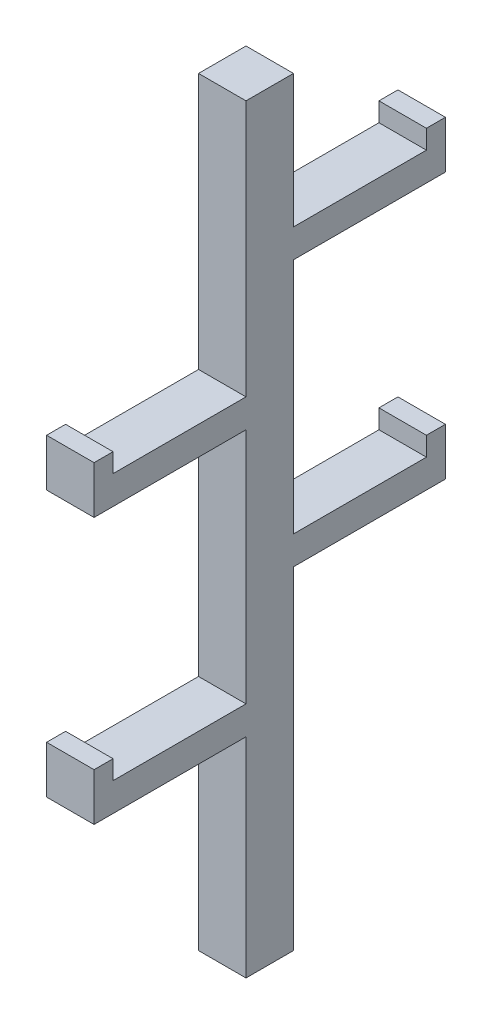
ISO-10303-21;
HEADER;
FILE_DESCRIPTION(('STEP AP214'),'2;1');
FILE_NAME('part.step','',(''),(''),'','','');
FILE_SCHEMA(('AUTOMOTIVE_DESIGN { 1 0 10303 214 1 1 1 1 }'));
ENDSEC;
DATA;
#1=APPLICATION_CONTEXT('core data for automotive mechanical design processes');
#2=APPLICATION_PROTOCOL_DEFINITION('international standard','automotive_design',2000,#1);
#3=PRODUCT_CONTEXT('',#1,'mechanical');
#4=PRODUCT('Part','Part','',(#3));
#5=PRODUCT_RELATED_PRODUCT_CATEGORY('part','',(#4));
#6=PRODUCT_DEFINITION_FORMATION('','',#4);
#7=PRODUCT_DEFINITION_CONTEXT('part definition',#1,'design');
#8=PRODUCT_DEFINITION('design','',#6,#7);
#9=PRODUCT_DEFINITION_SHAPE('','',#8);
#10=(LENGTH_UNIT() NAMED_UNIT(*) SI_UNIT(.MILLI.,.METRE.));
#11=(NAMED_UNIT(*) PLANE_ANGLE_UNIT() SI_UNIT($,.RADIAN.));
#12=(NAMED_UNIT(*) SI_UNIT($,.STERADIAN.) SOLID_ANGLE_UNIT());
#13=UNCERTAINTY_MEASURE_WITH_UNIT(LENGTH_MEASURE(1.E-05),#10,'distance_accuracy_value','');
#14=(GEOMETRIC_REPRESENTATION_CONTEXT(3) GLOBAL_UNCERTAINTY_ASSIGNED_CONTEXT((#13)) GLOBAL_UNIT_ASSIGNED_CONTEXT((#10,
#11,#12)) REPRESENTATION_CONTEXT('',''));
#15=CARTESIAN_POINT('',(0.,0.,0.));
#16=DIRECTION('',(0.,0.,1.));
#17=DIRECTION('',(1.,0.,0.));
#18=AXIS2_PLACEMENT_3D('',#15,#16,#17);
#19=CARTESIAN_POINT('',(-3.175,67.31,23.495));
#20=DIRECTION('',(0.,-1.,0.));
#21=DIRECTION('',(0.,0.,-1.));
#22=AXIS2_PLACEMENT_3D('',#19,#20,#21);
#23=PLANE('',#22);
#24=DIRECTION('',(-1.,0.,0.));
#25=VECTOR('',#24,1.);
#26=CARTESIAN_POINT('',(3.175,67.31,20.955));
#27=LINE('',#26,#25);
#28=CARTESIAN_POINT('',(3.175,67.31,20.955));
#29=VERTEX_POINT('',#28);
#30=CARTESIAN_POINT('',(-3.175,67.31,20.955));
#31=VERTEX_POINT('',#30);
#32=EDGE_CURVE('E244',#29,#31,#27,.T.);
#33=ORIENTED_EDGE('',*,*,#32,.F.);
#34=DIRECTION('',(0.,0.,-1.));
#35=VECTOR('',#34,1.);
#36=CARTESIAN_POINT('',(3.175,67.31,23.495));
#37=LINE('',#36,#35);
#38=CARTESIAN_POINT('',(3.175,67.31,3.175));
#39=VERTEX_POINT('',#38);
#40=EDGE_CURVE('E250',#29,#39,#37,.T.);
#41=ORIENTED_EDGE('',*,*,#40,.T.);
#42=DIRECTION('',(-1.,0.,0.));
#43=VECTOR('',#42,1.);
#44=CARTESIAN_POINT('',(-3.175,67.31,3.175));
#45=LINE('',#44,#43);
#46=CARTESIAN_POINT('',(-3.175,67.31,3.175));
#47=VERTEX_POINT('',#46);
#48=EDGE_CURVE('E360',#39,#47,#45,.T.);
#49=ORIENTED_EDGE('',*,*,#48,.T.);
#50=DIRECTION('',(0.,0.,-1.));
#51=VECTOR('',#50,1.);
#52=CARTESIAN_POINT('',(-3.175,67.31,23.495));
#53=LINE('',#52,#51);
#54=EDGE_CURVE('E357',#31,#47,#53,.T.);
#55=ORIENTED_EDGE('',*,*,#54,.F.);
#56=EDGE_LOOP('',(#33,#41,#49,#55));
#57=FACE_BOUND('',#56,.T.);
#58=ADVANCED_FACE('F40',(#57),#23,.F.);
#59=CARTESIAN_POINT('',(0.,83.82,-23.495));
#60=DIRECTION('',(0.,1.,0.));
#61=DIRECTION('',(0.,0.,1.));
#62=AXIS2_PLACEMENT_3D('',#59,#60,#61);
#63=PLANE('',#62);
#64=DIRECTION('',(0.,0.,1.));
#65=VECTOR('',#64,1.);
#66=CARTESIAN_POINT('',(3.175,83.82,-23.495));
#67=LINE('',#66,#65);
#68=CARTESIAN_POINT('',(3.175,83.82,-20.955));
#69=VERTEX_POINT('',#68);
#70=CARTESIAN_POINT('',(3.175,83.82,-3.175));
#71=VERTEX_POINT('',#70);
#72=EDGE_CURVE('E61',#69,#71,#67,.T.);
#73=ORIENTED_EDGE('',*,*,#72,.F.);
#74=DIRECTION('',(1.,0.,0.));
#75=VECTOR('',#74,1.);
#76=CARTESIAN_POINT('',(-3.175,83.82,-20.955));
#77=LINE('',#76,#75);
#78=CARTESIAN_POINT('',(-3.175,83.82,-20.955));
#79=VERTEX_POINT('',#78);
#80=EDGE_CURVE('E56',#79,#69,#77,.T.);
#81=ORIENTED_EDGE('',*,*,#80,.F.);
#82=DIRECTION('',(0.,0.,1.));
#83=VECTOR('',#82,1.);
#84=CARTESIAN_POINT('',(-3.175,83.82,-23.495));
#85=LINE('',#84,#83);
#86=CARTESIAN_POINT('',(-3.175,83.82,-3.175));
#87=VERTEX_POINT('',#86);
#88=EDGE_CURVE('E322',#79,#87,#85,.T.);
#89=ORIENTED_EDGE('',*,*,#88,.T.);
#90=DIRECTION('',(-1.,0.,0.));
#91=VECTOR('',#90,1.);
#92=CARTESIAN_POINT('',(0.,83.82,-3.175));
#93=LINE('',#92,#91);
#94=EDGE_CURVE('E310',#71,#87,#93,.T.);
#95=ORIENTED_EDGE('',*,*,#94,.F.);
#96=EDGE_LOOP('',(#73,#81,#89,#95));
#97=FACE_BOUND('',#96,.T.);
#98=ADVANCED_FACE('F486',(#97),#63,.T.);
#99=CARTESIAN_POINT('',(3.175,48.26,-23.495));
#100=DIRECTION('',(0.,1.,0.));
#101=DIRECTION('',(0.,0.,1.));
#102=AXIS2_PLACEMENT_3D('',#99,#100,#101);
#103=PLANE('',#102);
#104=DIRECTION('',(0.,0.,1.));
#105=VECTOR('',#104,1.);
#106=CARTESIAN_POINT('',(3.175,48.26,-23.495));
#107=LINE('',#106,#105);
#108=CARTESIAN_POINT('',(3.175,48.26,-20.955));
#109=VERTEX_POINT('',#108);
#110=CARTESIAN_POINT('',(3.175,48.26,-3.175));
#111=VERTEX_POINT('',#110);
#112=EDGE_CURVE('E293',#109,#111,#107,.T.);
#113=ORIENTED_EDGE('',*,*,#112,.F.);
#114=DIRECTION('',(1.,0.,0.));
#115=VECTOR('',#114,1.);
#116=CARTESIAN_POINT('',(3.175,48.26,-20.955));
#117=LINE('',#116,#115);
#118=CARTESIAN_POINT('',(-3.175,48.26,-20.955));
#119=VERTEX_POINT('',#118);
#120=EDGE_CURVE('E273',#119,#109,#117,.T.);
#121=ORIENTED_EDGE('',*,*,#120,.F.);
#122=DIRECTION('',(0.,0.,1.));
#123=VECTOR('',#122,1.);
#124=CARTESIAN_POINT('',(-3.175,48.26,-23.495));
#125=LINE('',#124,#123);
#126=CARTESIAN_POINT('',(-3.175,48.26,-3.175));
#127=VERTEX_POINT('',#126);
#128=EDGE_CURVE('E296',#119,#127,#125,.T.);
#129=ORIENTED_EDGE('',*,*,#128,.T.);
#130=DIRECTION('',(-1.,0.,0.));
#131=VECTOR('',#130,1.);
#132=CARTESIAN_POINT('',(3.175,48.26,-3.175));
#133=LINE('',#132,#131);
#134=EDGE_CURVE('E306',#111,#127,#133,.T.);
#135=ORIENTED_EDGE('',*,*,#134,.F.);
#136=EDGE_LOOP('',(#113,#121,#129,#135));
#137=FACE_BOUND('',#136,.T.);
#138=ADVANCED_FACE('F452',(#137),#103,.T.);
#139=CARTESIAN_POINT('',(3.175,101.6,-3.175));
#140=DIRECTION('',(0.,0.,1.));
#141=DIRECTION('',(1.,0.,0.));
#142=AXIS2_PLACEMENT_3D('',#139,#140,#141);
#143=PLANE('',#142);
#144=DIRECTION('',(-1.,0.,0.));
#145=VECTOR('',#144,1.);
#146=CARTESIAN_POINT('',(3.175,44.45,-3.175));
#147=LINE('',#146,#145);
#148=CARTESIAN_POINT('',(3.175,44.45,-3.175));
#149=VERTEX_POINT('',#148);
#150=CARTESIAN_POINT('',(-3.175,44.45,-3.175));
#151=VERTEX_POINT('',#150);
#152=EDGE_CURVE('E303',#149,#151,#147,.T.);
#153=ORIENTED_EDGE('',*,*,#152,.F.);
#154=DIRECTION('',(0.,-1.,0.));
#155=VECTOR('',#154,1.);
#156=CARTESIAN_POINT('',(3.175,101.6,-3.175));
#157=LINE('',#156,#155);
#158=CARTESIAN_POINT('',(3.175,0.,-3.175));
#159=VERTEX_POINT('',#158);
#160=EDGE_CURVE('E419',#149,#159,#157,.T.);
#161=ORIENTED_EDGE('',*,*,#160,.T.);
#162=DIRECTION('',(-1.,0.,0.));
#163=VECTOR('',#162,1.);
#164=CARTESIAN_POINT('',(3.175,0.,-3.175));
#165=LINE('',#164,#163);
#166=CARTESIAN_POINT('',(-3.175,0.,-3.175));
#167=VERTEX_POINT('',#166);
#168=EDGE_CURVE('E400',#159,#167,#165,.T.);
#169=ORIENTED_EDGE('',*,*,#168,.T.);
#170=DIRECTION('',(0.,-1.,0.));
#171=VECTOR('',#170,1.);
#172=CARTESIAN_POINT('',(-3.175,101.6,-3.175));
#173=LINE('',#172,#171);
#174=EDGE_CURVE('E406',#151,#167,#173,.T.);
#175=ORIENTED_EDGE('',*,*,#174,.F.);
#176=EDGE_LOOP('',(#153,#161,#169,#175));
#177=FACE_BOUND('',#176,.T.);
#178=ADVANCED_FACE('F443',(#177),#143,.F.);
#179=CARTESIAN_POINT('',(3.175,80.01,-3.175));
#180=VERTEX_POINT('',#179);
#181=EDGE_CURVE('E424',#180,#111,#157,.T.);
#182=ORIENTED_EDGE('',*,*,#181,.T.);
#183=ORIENTED_EDGE('',*,*,#134,.T.);
#184=CARTESIAN_POINT('',(-3.175,80.01,-3.175));
#185=VERTEX_POINT('',#184);
#186=EDGE_CURVE('E420',#185,#127,#173,.T.);
#187=ORIENTED_EDGE('',*,*,#186,.F.);
#188=DIRECTION('',(-1.,0.,0.));
#189=VECTOR('',#188,1.);
#190=CARTESIAN_POINT('',(0.,80.01,-3.175));
#191=LINE('',#190,#189);
#192=EDGE_CURVE('E318',#180,#185,#191,.T.);
#193=ORIENTED_EDGE('',*,*,#192,.F.);
#194=EDGE_LOOP('',(#182,#183,#187,#193));
#195=FACE_BOUND('',#194,.T.);
#196=ADVANCED_FACE('F448',(#195),#143,.F.);
#197=CARTESIAN_POINT('',(-3.175,31.75,23.495));
#198=DIRECTION('',(0.,-1.,0.));
#199=DIRECTION('',(1.,0.,0.));
#200=AXIS2_PLACEMENT_3D('',#197,#198,#199);
#201=PLANE('',#200);
#202=DIRECTION('',(-1.,0.,0.));
#203=VECTOR('',#202,1.);
#204=CARTESIAN_POINT('',(-3.17499999999997,31.75,20.955));
#205=LINE('',#204,#203);
#206=CARTESIAN_POINT('',(3.17500000000003,31.75,20.955));
#207=VERTEX_POINT('',#206);
#208=CARTESIAN_POINT('',(-3.17499999999997,31.75,20.955));
#209=VERTEX_POINT('',#208);
#210=EDGE_CURVE('E335',#207,#209,#205,.T.);
#211=ORIENTED_EDGE('',*,*,#210,.F.);
#212=DIRECTION('',(0.,0.,-1.));
#213=VECTOR('',#212,1.);
#214=CARTESIAN_POINT('',(3.175,31.75,23.495));
#215=LINE('',#214,#213);
#216=CARTESIAN_POINT('',(3.175,31.75,3.175));
#217=VERTEX_POINT('',#216);
#218=EDGE_CURVE('E387',#207,#217,#215,.T.);
#219=ORIENTED_EDGE('',*,*,#218,.T.);
#220=DIRECTION('',(-1.,0.,0.));
#221=VECTOR('',#220,1.);
#222=CARTESIAN_POINT('',(-3.175,31.75,3.175));
#223=LINE('',#222,#221);
#224=CARTESIAN_POINT('',(-3.175,31.75,3.175));
#225=VERTEX_POINT('',#224);
#226=EDGE_CURVE('E377',#217,#225,#223,.T.);
#227=ORIENTED_EDGE('',*,*,#226,.T.);
#228=DIRECTION('',(0.,0.,-1.));
#229=VECTOR('',#228,1.);
#230=CARTESIAN_POINT('',(-3.175,31.75,23.495));
#231=LINE('',#230,#229);
#232=EDGE_CURVE('E381',#209,#225,#231,.T.);
#233=ORIENTED_EDGE('',*,*,#232,.F.);
#234=EDGE_LOOP('',(#211,#219,#227,#233));
#235=FACE_BOUND('',#234,.T.);
#236=ADVANCED_FACE('F507',(#235),#201,.F.);
#237=CARTESIAN_POINT('',(3.175,101.6,3.175));
#238=DIRECTION('',(0.,0.,-1.));
#239=DIRECTION('',(-1.,0.,0.));
#240=AXIS2_PLACEMENT_3D('',#237,#238,#239);
#241=PLANE('',#240);
#242=DIRECTION('',(1.,0.,0.));
#243=VECTOR('',#242,1.);
#244=CARTESIAN_POINT('',(-3.175,63.5,3.175));
#245=LINE('',#244,#243);
#246=CARTESIAN_POINT('',(-3.175,63.5,3.175));
#247=VERTEX_POINT('',#246);
#248=CARTESIAN_POINT('',(3.175,63.5,3.175));
#249=VERTEX_POINT('',#248);
#250=EDGE_CURVE('E363',#247,#249,#245,.T.);
#251=ORIENTED_EDGE('',*,*,#250,.F.);
#252=DIRECTION('',(0.,-1.,0.));
#253=VECTOR('',#252,1.);
#254=CARTESIAN_POINT('',(-3.175,101.6,3.175));
#255=LINE('',#254,#253);
#256=EDGE_CURVE('E48',#247,#225,#255,.T.);
#257=ORIENTED_EDGE('',*,*,#256,.T.);
#258=ORIENTED_EDGE('',*,*,#226,.F.);
#259=DIRECTION('',(0.,-1.,0.));
#260=VECTOR('',#259,1.);
#261=CARTESIAN_POINT('',(3.175,101.6,3.175));
#262=LINE('',#261,#260);
#263=EDGE_CURVE('E426',#249,#217,#262,.T.);
#264=ORIENTED_EDGE('',*,*,#263,.F.);
#265=EDGE_LOOP('',(#251,#257,#258,#264));
#266=FACE_BOUND('',#265,.T.);
#267=ADVANCED_FACE('F510',(#266),#241,.F.);
#268=ORIENTED_EDGE('',*,*,#48,.F.);
#269=CARTESIAN_POINT('',(3.175,101.6,3.175));
#270=VERTEX_POINT('',#269);
#271=EDGE_CURVE('E425',#270,#39,#262,.T.);
#272=ORIENTED_EDGE('',*,*,#271,.F.);
#273=DIRECTION('',(1.,0.,0.));
#274=VECTOR('',#273,1.);
#275=CARTESIAN_POINT('',(3.175,101.6,3.175));
#276=LINE('',#275,#274);
#277=CARTESIAN_POINT('',(-3.175,101.6,3.175));
#278=VERTEX_POINT('',#277);
#279=EDGE_CURVE('E399',#278,#270,#276,.T.);
#280=ORIENTED_EDGE('',*,*,#279,.F.);
#281=EDGE_CURVE('E11',#278,#47,#255,.T.);
#282=ORIENTED_EDGE('',*,*,#281,.T.);
#283=EDGE_LOOP('',(#268,#272,#280,#282));
#284=FACE_BOUND('',#283,.T.);
#285=ADVANCED_FACE('F527',(#284),#241,.F.);
#286=DIRECTION('',(1.,0.,0.));
#287=VECTOR('',#286,1.);
#288=CARTESIAN_POINT('',(-3.175,27.94,3.175));
#289=LINE('',#288,#287);
#290=CARTESIAN_POINT('',(-3.175,27.94,3.175));
#291=VERTEX_POINT('',#290);
#292=CARTESIAN_POINT('',(3.175,27.94,3.175));
#293=VERTEX_POINT('',#292);
#294=EDGE_CURVE('E367',#291,#293,#289,.T.);
#295=ORIENTED_EDGE('',*,*,#294,.F.);
#296=CARTESIAN_POINT('',(-3.175,0.,3.175));
#297=VERTEX_POINT('',#296);
#298=EDGE_CURVE('E49',#291,#297,#255,.T.);
#299=ORIENTED_EDGE('',*,*,#298,.T.);
#300=DIRECTION('',(1.,0.,0.));
#301=VECTOR('',#300,1.);
#302=CARTESIAN_POINT('',(3.175,0.,3.175));
#303=LINE('',#302,#301);
#304=CARTESIAN_POINT('',(3.175,0.,3.175));
#305=VERTEX_POINT('',#304);
#306=EDGE_CURVE('E409',#297,#305,#303,.T.);
#307=ORIENTED_EDGE('',*,*,#306,.T.);
#308=EDGE_CURVE('E423',#293,#305,#262,.T.);
#309=ORIENTED_EDGE('',*,*,#308,.F.);
#310=EDGE_LOOP('',(#295,#299,#307,#309));
#311=FACE_BOUND('',#310,.T.);
#312=ADVANCED_FACE('F436',(#311),#241,.F.);
#313=CARTESIAN_POINT('',(-3.175,101.6,3.175));
#314=DIRECTION('',(1.,0.,0.));
#315=DIRECTION('',(0.,0.,-1.));
#316=AXIS2_PLACEMENT_3D('',#313,#314,#315);
#317=PLANE('',#316);
#318=DIRECTION('',(0.,0.,1.));
#319=VECTOR('',#318,1.);
#320=CARTESIAN_POINT('',(-3.175,0.,3.175));
#321=LINE('',#320,#319);
#322=EDGE_CURVE('E395',#167,#297,#321,.T.);
#323=ORIENTED_EDGE('',*,*,#322,.T.);
#324=ORIENTED_EDGE('',*,*,#298,.F.);
#325=DIRECTION('',(0.,0.,-1.));
#326=VECTOR('',#325,1.);
#327=CARTESIAN_POINT('',(-3.175,27.94,23.495));
#328=LINE('',#327,#326);
#329=CARTESIAN_POINT('',(-3.175,27.94,23.495));
#330=VERTEX_POINT('',#329);
#331=EDGE_CURVE('E392',#330,#291,#328,.T.);
#332=ORIENTED_EDGE('',*,*,#331,.F.);
#333=DIRECTION('',(0.,-1.,0.));
#334=VECTOR('',#333,1.);
#335=CARTESIAN_POINT('',(-3.175,27.94,23.495));
#336=LINE('',#335,#334);
#337=CARTESIAN_POINT('',(-3.17499999999997,34.29,23.495));
#338=VERTEX_POINT('',#337);
#339=EDGE_CURVE('E373',#338,#330,#336,.T.);
#340=ORIENTED_EDGE('',*,*,#339,.F.);
#341=DIRECTION('',(0.,0.,1.));
#342=VECTOR('',#341,1.);
#343=CARTESIAN_POINT('',(-3.17499999999997,34.29,23.495));
#344=LINE('',#343,#342);
#345=CARTESIAN_POINT('',(-3.17499999999997,34.29,20.955));
#346=VERTEX_POINT('',#345);
#347=EDGE_CURVE('E336',#346,#338,#344,.T.);
#348=ORIENTED_EDGE('',*,*,#347,.F.);
#349=DIRECTION('',(0.,-1.,0.));
#350=VECTOR('',#349,1.);
#351=CARTESIAN_POINT('',(-3.17499999999997,34.29,20.955));
#352=LINE('',#351,#350);
#353=EDGE_CURVE('E346',#346,#209,#352,.T.);
#354=ORIENTED_EDGE('',*,*,#353,.T.);
#355=ORIENTED_EDGE('',*,*,#232,.T.);
#356=ORIENTED_EDGE('',*,*,#256,.F.);
#357=DIRECTION('',(0.,0.,-1.));
#358=VECTOR('',#357,1.);
#359=CARTESIAN_POINT('',(-3.175,63.5,23.495));
#360=LINE('',#359,#358);
#361=CARTESIAN_POINT('',(-3.175,63.5,23.495));
#362=VERTEX_POINT('',#361);
#363=EDGE_CURVE('E352',#362,#247,#360,.T.);
#364=ORIENTED_EDGE('',*,*,#363,.F.);
#365=DIRECTION('',(0.,-1.,0.));
#366=VECTOR('',#365,1.);
#367=CARTESIAN_POINT('',(-3.175,63.5,23.495));
#368=LINE('',#367,#366);
#369=CARTESIAN_POINT('',(-3.175,69.85,23.495));
#370=VERTEX_POINT('',#369);
#371=EDGE_CURVE('E364',#370,#362,#368,.T.);
#372=ORIENTED_EDGE('',*,*,#371,.F.);
#373=DIRECTION('',(0.,0.,1.));
#374=VECTOR('',#373,1.);
#375=CARTESIAN_POINT('',(-3.175,69.85,23.495));
#376=LINE('',#375,#374);
#377=CARTESIAN_POINT('',(-3.175,69.85,20.955));
#378=VERTEX_POINT('',#377);
#379=EDGE_CURVE('E234',#378,#370,#376,.T.);
#380=ORIENTED_EDGE('',*,*,#379,.F.);
#381=DIRECTION('',(0.,-1.,0.));
#382=VECTOR('',#381,1.);
#383=CARTESIAN_POINT('',(-3.175,69.85,20.955));
#384=LINE('',#383,#382);
#385=EDGE_CURVE('E230',#378,#31,#384,.T.);
#386=ORIENTED_EDGE('',*,*,#385,.T.);
#387=ORIENTED_EDGE('',*,*,#54,.T.);
#388=ORIENTED_EDGE('',*,*,#281,.F.);
#389=DIRECTION('',(0.,0.,1.));
#390=VECTOR('',#389,1.);
#391=CARTESIAN_POINT('',(-3.175,101.6,3.175));
#392=LINE('',#391,#390);
#393=CARTESIAN_POINT('',(-3.175,101.6,-3.175));
#394=VERTEX_POINT('',#393);
#395=EDGE_CURVE('E396',#394,#278,#392,.T.);
#396=ORIENTED_EDGE('',*,*,#395,.F.);
#397=EDGE_CURVE('E416',#394,#87,#173,.T.);
#398=ORIENTED_EDGE('',*,*,#397,.T.);
#399=ORIENTED_EDGE('',*,*,#88,.F.);
#400=DIRECTION('',(0.,-1.,0.));
#401=VECTOR('',#400,1.);
#402=CARTESIAN_POINT('',(-3.175,86.36,-20.955));
#403=LINE('',#402,#401);
#404=CARTESIAN_POINT('',(-3.175,86.36,-20.955));
#405=VERTEX_POINT('',#404);
#406=EDGE_CURVE('E270',#405,#79,#403,.T.);
#407=ORIENTED_EDGE('',*,*,#406,.F.);
#408=DIRECTION('',(0.,0.,1.));
#409=VECTOR('',#408,1.);
#410=CARTESIAN_POINT('',(-3.175,86.36,-23.495));
#411=LINE('',#410,#409);
#412=CARTESIAN_POINT('',(-3.175,86.36,-23.495));
#413=VERTEX_POINT('',#412);
#414=EDGE_CURVE('E252',#413,#405,#411,.T.);
#415=ORIENTED_EDGE('',*,*,#414,.F.);
#416=DIRECTION('',(0.,1.,0.));
#417=VECTOR('',#416,1.);
#418=CARTESIAN_POINT('',(-3.175,0.,-23.495));
#419=LINE('',#418,#417);
#420=CARTESIAN_POINT('',(-3.175,80.01,-23.495));
#421=VERTEX_POINT('',#420);
#422=EDGE_CURVE('E320',#421,#413,#419,.T.);
#423=ORIENTED_EDGE('',*,*,#422,.F.);
#424=DIRECTION('',(0.,0.,1.));
#425=VECTOR('',#424,1.);
#426=CARTESIAN_POINT('',(-3.175,80.01,-23.495));
#427=LINE('',#426,#425);
#428=EDGE_CURVE('E328',#421,#185,#427,.T.);
#429=ORIENTED_EDGE('',*,*,#428,.T.);
#430=ORIENTED_EDGE('',*,*,#186,.T.);
#431=ORIENTED_EDGE('',*,*,#128,.F.);
#432=DIRECTION('',(0.,-1.,0.));
#433=VECTOR('',#432,1.);
#434=CARTESIAN_POINT('',(-3.175,50.8,-20.955));
#435=LINE('',#434,#433);
#436=CARTESIAN_POINT('',(-3.175,50.8,-20.955));
#437=VERTEX_POINT('',#436);
#438=EDGE_CURVE('E289',#437,#119,#435,.T.);
#439=ORIENTED_EDGE('',*,*,#438,.F.);
#440=DIRECTION('',(0.,0.,1.));
#441=VECTOR('',#440,1.);
#442=CARTESIAN_POINT('',(-3.175,50.8,-23.495));
#443=LINE('',#442,#441);
#444=CARTESIAN_POINT('',(-3.175,50.8,-23.495));
#445=VERTEX_POINT('',#444);
#446=EDGE_CURVE('E280',#445,#437,#443,.T.);
#447=ORIENTED_EDGE('',*,*,#446,.F.);
#448=DIRECTION('',(0.,1.,0.));
#449=VECTOR('',#448,1.);
#450=CARTESIAN_POINT('',(-3.175,44.45,-23.495));
#451=LINE('',#450,#449);
#452=CARTESIAN_POINT('',(-3.175,44.45,-23.495));
#453=VERTEX_POINT('',#452);
#454=EDGE_CURVE('E312',#453,#445,#451,.T.);
#455=ORIENTED_EDGE('',*,*,#454,.F.);
#456=DIRECTION('',(0.,0.,1.));
#457=VECTOR('',#456,1.);
#458=CARTESIAN_POINT('',(-3.175,44.45,-23.495));
#459=LINE('',#458,#457);
#460=EDGE_CURVE('E298',#453,#151,#459,.T.);
#461=ORIENTED_EDGE('',*,*,#460,.T.);
#462=ORIENTED_EDGE('',*,*,#174,.T.);
#463=EDGE_LOOP('',(#323,#324,#332,#340,#348,#354,#355,#356,#364,#372,#380,#386,#387,#388,#396,
#398,#399,#407,#415,#423,#429,#430,#431,#439,#447,#455,#461,#462));
#464=FACE_BOUND('',#463,.T.);
#465=ADVANCED_FACE('F42',(#464),#317,.F.);
#466=CARTESIAN_POINT('',(3.175,101.6,3.175));
#467=DIRECTION('',(-1.,0.,0.));
#468=DIRECTION('',(0.,0.,1.));
#469=AXIS2_PLACEMENT_3D('',#466,#467,#468);
#470=PLANE('',#469);
#471=DIRECTION('',(0.,0.,-1.));
#472=VECTOR('',#471,1.);
#473=CARTESIAN_POINT('',(3.175,0.,3.175));
#474=LINE('',#473,#472);
#475=EDGE_CURVE('E412',#305,#159,#474,.T.);
#476=ORIENTED_EDGE('',*,*,#475,.T.);
#477=ORIENTED_EDGE('',*,*,#160,.F.);
#478=DIRECTION('',(0.,0.,1.));
#479=VECTOR('',#478,1.);
#480=CARTESIAN_POINT('',(3.175,44.45,-23.495));
#481=LINE('',#480,#479);
#482=CARTESIAN_POINT('',(3.175,44.45,-23.495));
#483=VERTEX_POINT('',#482);
#484=EDGE_CURVE('E292',#483,#149,#481,.T.);
#485=ORIENTED_EDGE('',*,*,#484,.F.);
#486=DIRECTION('',(0.,1.,0.));
#487=VECTOR('',#486,1.);
#488=CARTESIAN_POINT('',(3.175,44.45,-23.495));
#489=LINE('',#488,#487);
#490=CARTESIAN_POINT('',(3.175,50.8,-23.495));
#491=VERTEX_POINT('',#490);
#492=EDGE_CURVE('E307',#483,#491,#489,.T.);
#493=ORIENTED_EDGE('',*,*,#492,.T.);
#494=DIRECTION('',(0.,0.,-1.));
#495=VECTOR('',#494,1.);
#496=CARTESIAN_POINT('',(3.175,50.8,-23.495));
#497=LINE('',#496,#495);
#498=CARTESIAN_POINT('',(3.175,50.8,-20.955));
#499=VERTEX_POINT('',#498);
#500=EDGE_CURVE('E274',#499,#491,#497,.T.);
#501=ORIENTED_EDGE('',*,*,#500,.F.);
#502=DIRECTION('',(0.,-1.,0.));
#503=VECTOR('',#502,1.);
#504=CARTESIAN_POINT('',(3.175,50.8,-20.955));
#505=LINE('',#504,#503);
#506=EDGE_CURVE('E284',#499,#109,#505,.T.);
#507=ORIENTED_EDGE('',*,*,#506,.T.);
#508=ORIENTED_EDGE('',*,*,#112,.T.);
#509=ORIENTED_EDGE('',*,*,#181,.F.);
#510=DIRECTION('',(0.,0.,1.));
#511=VECTOR('',#510,1.);
#512=CARTESIAN_POINT('',(3.175,80.01,-23.495));
#513=LINE('',#512,#511);
#514=CARTESIAN_POINT('',(3.175,80.01,-23.495));
#515=VERTEX_POINT('',#514);
#516=EDGE_CURVE('E331',#515,#180,#513,.T.);
#517=ORIENTED_EDGE('',*,*,#516,.F.);
#518=DIRECTION('',(0.,-1.,0.));
#519=VECTOR('',#518,1.);
#520=CARTESIAN_POINT('',(3.175,0.,-23.495));
#521=LINE('',#520,#519);
#522=CARTESIAN_POINT('',(3.175,86.36,-23.495));
#523=VERTEX_POINT('',#522);
#524=EDGE_CURVE('E315',#523,#515,#521,.T.);
#525=ORIENTED_EDGE('',*,*,#524,.F.);
#526=DIRECTION('',(0.,0.,-1.));
#527=VECTOR('',#526,1.);
#528=CARTESIAN_POINT('',(3.175,86.36,-23.495));
#529=LINE('',#528,#527);
#530=CARTESIAN_POINT('',(3.175,86.36,-20.955));
#531=VERTEX_POINT('',#530);
#532=EDGE_CURVE('E261',#531,#523,#529,.T.);
#533=ORIENTED_EDGE('',*,*,#532,.F.);
#534=DIRECTION('',(0.,-1.,0.));
#535=VECTOR('',#534,1.);
#536=CARTESIAN_POINT('',(3.175,86.36,-20.955));
#537=LINE('',#536,#535);
#538=EDGE_CURVE('E266',#531,#69,#537,.T.);
#539=ORIENTED_EDGE('',*,*,#538,.T.);
#540=ORIENTED_EDGE('',*,*,#72,.T.);
#541=CARTESIAN_POINT('',(3.175,101.6,-3.175));
#542=VERTEX_POINT('',#541);
#543=EDGE_CURVE('E421',#542,#71,#157,.T.);
#544=ORIENTED_EDGE('',*,*,#543,.F.);
#545=DIRECTION('',(0.,0.,-1.));
#546=VECTOR('',#545,1.);
#547=CARTESIAN_POINT('',(3.175,101.6,3.175));
#548=LINE('',#547,#546);
#549=EDGE_CURVE('E402',#270,#542,#548,.T.);
#550=ORIENTED_EDGE('',*,*,#549,.F.);
#551=ORIENTED_EDGE('',*,*,#271,.T.);
#552=ORIENTED_EDGE('',*,*,#40,.F.);
#553=DIRECTION('',(0.,-1.,0.));
#554=VECTOR('',#553,1.);
#555=CARTESIAN_POINT('',(3.175,69.85,20.955));
#556=LINE('',#555,#554);
#557=CARTESIAN_POINT('',(3.175,69.85,20.955));
#558=VERTEX_POINT('',#557);
#559=EDGE_CURVE('E227',#558,#29,#556,.T.);
#560=ORIENTED_EDGE('',*,*,#559,.F.);
#561=DIRECTION('',(0.,0.,-1.));
#562=VECTOR('',#561,1.);
#563=CARTESIAN_POINT('',(3.175,69.85,23.495));
#564=LINE('',#563,#562);
#565=CARTESIAN_POINT('',(3.175,69.85,23.495));
#566=VERTEX_POINT('',#565);
#567=EDGE_CURVE('E235',#566,#558,#564,.T.);
#568=ORIENTED_EDGE('',*,*,#567,.F.);
#569=DIRECTION('',(0.,1.,0.));
#570=VECTOR('',#569,1.);
#571=CARTESIAN_POINT('',(3.175,63.5,23.495));
#572=LINE('',#571,#570);
#573=CARTESIAN_POINT('',(3.175,63.5,23.495));
#574=VERTEX_POINT('',#573);
#575=EDGE_CURVE('E359',#574,#566,#572,.T.);
#576=ORIENTED_EDGE('',*,*,#575,.F.);
#577=DIRECTION('',(0.,0.,-1.));
#578=VECTOR('',#577,1.);
#579=CARTESIAN_POINT('',(3.175,63.5,23.495));
#580=LINE('',#579,#578);
#581=EDGE_CURVE('E354',#574,#249,#580,.T.);
#582=ORIENTED_EDGE('',*,*,#581,.T.);
#583=ORIENTED_EDGE('',*,*,#263,.T.);
#584=ORIENTED_EDGE('',*,*,#218,.F.);
#585=DIRECTION('',(0.,-1.,0.));
#586=VECTOR('',#585,1.);
#587=CARTESIAN_POINT('',(3.17500000000003,34.29,20.955));
#588=LINE('',#587,#586);
#589=CARTESIAN_POINT('',(3.17500000000003,34.29,20.955));
#590=VERTEX_POINT('',#589);
#591=EDGE_CURVE('E350',#590,#207,#588,.T.);
#592=ORIENTED_EDGE('',*,*,#591,.F.);
#593=DIRECTION('',(0.,0.,-1.));
#594=VECTOR('',#593,1.);
#595=CARTESIAN_POINT('',(3.17500000000003,34.29,23.495));
#596=LINE('',#595,#594);
#597=CARTESIAN_POINT('',(3.17500000000003,34.29,23.495));
#598=VERTEX_POINT('',#597);
#599=EDGE_CURVE('E342',#598,#590,#596,.T.);
#600=ORIENTED_EDGE('',*,*,#599,.F.);
#601=DIRECTION('',(0.,1.,0.));
#602=VECTOR('',#601,1.);
#603=CARTESIAN_POINT('',(3.175,27.94,23.495));
#604=LINE('',#603,#602);
#605=CARTESIAN_POINT('',(3.175,27.94,23.495));
#606=VERTEX_POINT('',#605);
#607=EDGE_CURVE('E379',#606,#598,#604,.T.);
#608=ORIENTED_EDGE('',*,*,#607,.F.);
#609=DIRECTION('',(0.,0.,-1.));
#610=VECTOR('',#609,1.);
#611=CARTESIAN_POINT('',(3.175,27.94,23.495));
#612=LINE('',#611,#610);
#613=EDGE_CURVE('E389',#606,#293,#612,.T.);
#614=ORIENTED_EDGE('',*,*,#613,.T.);
#615=ORIENTED_EDGE('',*,*,#308,.T.);
#616=EDGE_LOOP('',(#476,#477,#485,#493,#501,#507,#508,#509,#517,#525,#533,#539,#540,#544,#550,
#551,#552,#560,#568,#576,#582,#583,#584,#592,#600,#608,#614,#615));
#617=FACE_BOUND('',#616,.T.);
#618=ADVANCED_FACE('F248',(#617),#470,.F.);
#619=ORIENTED_EDGE('',*,*,#543,.T.);
#620=ORIENTED_EDGE('',*,*,#94,.T.);
#621=ORIENTED_EDGE('',*,*,#397,.F.);
#622=DIRECTION('',(-1.,0.,0.));
#623=VECTOR('',#622,1.);
#624=CARTESIAN_POINT('',(3.175,101.6,-3.175));
#625=LINE('',#624,#623);
#626=EDGE_CURVE('E404',#542,#394,#625,.T.);
#627=ORIENTED_EDGE('',*,*,#626,.F.);
#628=EDGE_LOOP('',(#619,#620,#621,#627));
#629=FACE_BOUND('',#628,.T.);
#630=ADVANCED_FACE('F518',(#629),#143,.F.);
#631=CARTESIAN_POINT('',(0.,101.6,0.));
#632=DIRECTION('',(0.,1.,0.));
#633=DIRECTION('',(0.,0.,1.));
#634=AXIS2_PLACEMENT_3D('',#631,#632,#633);
#635=PLANE('',#634);
#636=ORIENTED_EDGE('',*,*,#395,.T.);
#637=ORIENTED_EDGE('',*,*,#279,.T.);
#638=ORIENTED_EDGE('',*,*,#549,.T.);
#639=ORIENTED_EDGE('',*,*,#626,.T.);
#640=EDGE_LOOP('',(#636,#637,#638,#639));
#641=FACE_BOUND('',#640,.T.);
#642=ADVANCED_FACE('F515',(#641),#635,.T.);
#643=CARTESIAN_POINT('',(0.,0.,0.));
#644=DIRECTION('',(0.,1.,0.));
#645=DIRECTION('',(0.,0.,1.));
#646=AXIS2_PLACEMENT_3D('',#643,#644,#645);
#647=PLANE('',#646);
#648=ORIENTED_EDGE('',*,*,#322,.F.);
#649=ORIENTED_EDGE('',*,*,#168,.F.);
#650=ORIENTED_EDGE('',*,*,#475,.F.);
#651=ORIENTED_EDGE('',*,*,#306,.F.);
#652=EDGE_LOOP('',(#648,#649,#650,#651));
#653=FACE_BOUND('',#652,.T.);
#654=ADVANCED_FACE('F440',(#653),#647,.F.);
#655=CARTESIAN_POINT('',(-3.175,27.94,23.495));
#656=DIRECTION('',(0.,1.,0.));
#657=DIRECTION('',(-1.,0.,0.));
#658=AXIS2_PLACEMENT_3D('',#655,#656,#657);
#659=PLANE('',#658);
#660=ORIENTED_EDGE('',*,*,#294,.T.);
#661=ORIENTED_EDGE('',*,*,#613,.F.);
#662=DIRECTION('',(1.,0.,0.));
#663=VECTOR('',#662,1.);
#664=CARTESIAN_POINT('',(-3.175,27.94,23.495));
#665=LINE('',#664,#663);
#666=EDGE_CURVE('E376',#330,#606,#665,.T.);
#667=ORIENTED_EDGE('',*,*,#666,.F.);
#668=ORIENTED_EDGE('',*,*,#331,.T.);
#669=EDGE_LOOP('',(#660,#661,#667,#668));
#670=FACE_BOUND('',#669,.T.);
#671=ADVANCED_FACE('F505',(#670),#659,.F.);
#672=CARTESIAN_POINT('',(0.,0.,23.495));
#673=DIRECTION('',(0.,0.,-1.));
#674=DIRECTION('',(-1.,0.,0.));
#675=AXIS2_PLACEMENT_3D('',#672,#673,#674);
#676=PLANE('',#675);
#677=ORIENTED_EDGE('',*,*,#339,.T.);
#678=ORIENTED_EDGE('',*,*,#666,.T.);
#679=ORIENTED_EDGE('',*,*,#607,.T.);
#680=DIRECTION('',(1.,0.,0.));
#681=VECTOR('',#680,1.);
#682=CARTESIAN_POINT('',(-3.17499999999997,34.29,23.495));
#683=LINE('',#682,#681);
#684=EDGE_CURVE('E339',#338,#598,#683,.T.);
#685=ORIENTED_EDGE('',*,*,#684,.F.);
#686=EDGE_LOOP('',(#677,#678,#679,#685));
#687=FACE_BOUND('',#686,.T.);
#688=ADVANCED_FACE('F502',(#687),#676,.F.);
#689=CARTESIAN_POINT('',(-3.175,63.5,23.495));
#690=DIRECTION('',(0.,1.,0.));
#691=DIRECTION('',(0.,0.,1.));
#692=AXIS2_PLACEMENT_3D('',#689,#690,#691);
#693=PLANE('',#692);
#694=ORIENTED_EDGE('',*,*,#250,.T.);
#695=ORIENTED_EDGE('',*,*,#581,.F.);
#696=DIRECTION('',(1.,0.,0.));
#697=VECTOR('',#696,1.);
#698=CARTESIAN_POINT('',(-3.175,63.5,23.495));
#699=LINE('',#698,#697);
#700=EDGE_CURVE('E369',#362,#574,#699,.T.);
#701=ORIENTED_EDGE('',*,*,#700,.F.);
#702=ORIENTED_EDGE('',*,*,#363,.T.);
#703=EDGE_LOOP('',(#694,#695,#701,#702));
#704=FACE_BOUND('',#703,.T.);
#705=ADVANCED_FACE('F495',(#704),#693,.F.);
#706=CARTESIAN_POINT('',(0.,0.,23.495));
#707=DIRECTION('',(0.,0.,-1.));
#708=DIRECTION('',(-1.,0.,0.));
#709=AXIS2_PLACEMENT_3D('',#706,#707,#708);
#710=PLANE('',#709);
#711=ORIENTED_EDGE('',*,*,#371,.T.);
#712=ORIENTED_EDGE('',*,*,#700,.T.);
#713=ORIENTED_EDGE('',*,*,#575,.T.);
#714=DIRECTION('',(1.,0.,0.));
#715=VECTOR('',#714,1.);
#716=CARTESIAN_POINT('',(3.175,69.85,23.495));
#717=LINE('',#716,#715);
#718=EDGE_CURVE('E241',#370,#566,#717,.T.);
#719=ORIENTED_EDGE('',*,*,#718,.F.);
#720=EDGE_LOOP('',(#711,#712,#713,#719));
#721=FACE_BOUND('',#720,.T.);
#722=ADVANCED_FACE('F497',(#721),#710,.F.);
#723=CARTESIAN_POINT('',(-3.17499999999997,34.29,20.955));
#724=DIRECTION('',(0.,0.,1.));
#725=DIRECTION('',(1.,0.,0.));
#726=AXIS2_PLACEMENT_3D('',#723,#724,#725);
#727=PLANE('',#726);
#728=ORIENTED_EDGE('',*,*,#210,.T.);
#729=ORIENTED_EDGE('',*,*,#353,.F.);
#730=DIRECTION('',(-1.,0.,0.));
#731=VECTOR('',#730,1.);
#732=CARTESIAN_POINT('',(-3.17499999999997,34.29,20.955));
#733=LINE('',#732,#731);
#734=EDGE_CURVE('E344',#590,#346,#733,.T.);
#735=ORIENTED_EDGE('',*,*,#734,.F.);
#736=ORIENTED_EDGE('',*,*,#591,.T.);
#737=EDGE_LOOP('',(#728,#729,#735,#736));
#738=FACE_BOUND('',#737,.T.);
#739=ADVANCED_FACE('F500',(#738),#727,.F.);
#740=CARTESIAN_POINT('',(0.,34.29,0.));
#741=DIRECTION('',(0.,-1.,0.));
#742=DIRECTION('',(0.,0.,-1.));
#743=AXIS2_PLACEMENT_3D('',#740,#741,#742);
#744=PLANE('',#743);
#745=ORIENTED_EDGE('',*,*,#347,.T.);
#746=ORIENTED_EDGE('',*,*,#684,.T.);
#747=ORIENTED_EDGE('',*,*,#599,.T.);
#748=ORIENTED_EDGE('',*,*,#734,.T.);
#749=EDGE_LOOP('',(#745,#746,#747,#748));
#750=FACE_BOUND('',#749,.T.);
#751=ADVANCED_FACE('F584',(#750),#744,.F.);
#752=CARTESIAN_POINT('',(0.,80.01,-23.495));
#753=DIRECTION('',(0.,1.,0.));
#754=DIRECTION('',(0.,0.,1.));
#755=AXIS2_PLACEMENT_3D('',#752,#753,#754);
#756=PLANE('',#755);
#757=ORIENTED_EDGE('',*,*,#192,.T.);
#758=ORIENTED_EDGE('',*,*,#428,.F.);
#759=DIRECTION('',(-1.,0.,0.));
#760=VECTOR('',#759,1.);
#761=CARTESIAN_POINT('',(0.,80.01,-23.495));
#762=LINE('',#761,#760);
#763=EDGE_CURVE('E317',#515,#421,#762,.T.);
#764=ORIENTED_EDGE('',*,*,#763,.F.);
#765=ORIENTED_EDGE('',*,*,#516,.T.);
#766=EDGE_LOOP('',(#757,#758,#764,#765));
#767=FACE_BOUND('',#766,.T.);
#768=ADVANCED_FACE('F481',(#767),#756,.F.);
#769=CARTESIAN_POINT('',(0.,0.,-23.495));
#770=DIRECTION('',(0.,0.,-1.));
#771=DIRECTION('',(-1.,0.,0.));
#772=AXIS2_PLACEMENT_3D('',#769,#770,#771);
#773=PLANE('',#772);
#774=ORIENTED_EDGE('',*,*,#422,.T.);
#775=DIRECTION('',(-1.,0.,0.));
#776=VECTOR('',#775,1.);
#777=CARTESIAN_POINT('',(-3.175,86.36,-23.495));
#778=LINE('',#777,#776);
#779=EDGE_CURVE('E264',#523,#413,#778,.T.);
#780=ORIENTED_EDGE('',*,*,#779,.F.);
#781=ORIENTED_EDGE('',*,*,#524,.T.);
#782=ORIENTED_EDGE('',*,*,#763,.T.);
#783=EDGE_LOOP('',(#774,#780,#781,#782));
#784=FACE_BOUND('',#783,.T.);
#785=ADVANCED_FACE('F474',(#784),#773,.T.);
#786=CARTESIAN_POINT('',(3.175,44.45,-23.495));
#787=DIRECTION('',(0.,1.,0.));
#788=DIRECTION('',(0.,0.,1.));
#789=AXIS2_PLACEMENT_3D('',#786,#787,#788);
#790=PLANE('',#789);
#791=ORIENTED_EDGE('',*,*,#152,.T.);
#792=ORIENTED_EDGE('',*,*,#460,.F.);
#793=DIRECTION('',(-1.,0.,0.));
#794=VECTOR('',#793,1.);
#795=CARTESIAN_POINT('',(3.175,44.45,-23.495));
#796=LINE('',#795,#794);
#797=EDGE_CURVE('E295',#483,#453,#796,.T.);
#798=ORIENTED_EDGE('',*,*,#797,.F.);
#799=ORIENTED_EDGE('',*,*,#484,.T.);
#800=EDGE_LOOP('',(#791,#792,#798,#799));
#801=FACE_BOUND('',#800,.T.);
#802=ADVANCED_FACE('F472',(#801),#790,.F.);
#803=CARTESIAN_POINT('',(0.,0.,-23.495));
#804=DIRECTION('',(0.,0.,1.));
#805=DIRECTION('',(1.,0.,0.));
#806=AXIS2_PLACEMENT_3D('',#803,#804,#805);
#807=PLANE('',#806);
#808=ORIENTED_EDGE('',*,*,#492,.F.);
#809=ORIENTED_EDGE('',*,*,#797,.T.);
#810=ORIENTED_EDGE('',*,*,#454,.T.);
#811=DIRECTION('',(-1.,0.,0.));
#812=VECTOR('',#811,1.);
#813=CARTESIAN_POINT('',(3.175,50.8,-23.495));
#814=LINE('',#813,#812);
#815=EDGE_CURVE('E277',#491,#445,#814,.T.);
#816=ORIENTED_EDGE('',*,*,#815,.F.);
#817=EDGE_LOOP('',(#808,#809,#810,#816));
#818=FACE_BOUND('',#817,.T.);
#819=ADVANCED_FACE('F469',(#818),#807,.F.);
#820=CARTESIAN_POINT('',(3.175,50.8,-20.955));
#821=DIRECTION('',(0.,0.,-1.));
#822=DIRECTION('',(-1.,0.,0.));
#823=AXIS2_PLACEMENT_3D('',#820,#821,#822);
#824=PLANE('',#823);
#825=ORIENTED_EDGE('',*,*,#120,.T.);
#826=ORIENTED_EDGE('',*,*,#506,.F.);
#827=DIRECTION('',(1.,0.,0.));
#828=VECTOR('',#827,1.);
#829=CARTESIAN_POINT('',(3.175,50.8,-20.955));
#830=LINE('',#829,#828);
#831=EDGE_CURVE('E282',#437,#499,#830,.T.);
#832=ORIENTED_EDGE('',*,*,#831,.F.);
#833=ORIENTED_EDGE('',*,*,#438,.T.);
#834=EDGE_LOOP('',(#825,#826,#832,#833));
#835=FACE_BOUND('',#834,.T.);
#836=ADVANCED_FACE('F459',(#835),#824,.F.);
#837=CARTESIAN_POINT('',(0.,50.8,0.));
#838=DIRECTION('',(0.,-1.,0.));
#839=DIRECTION('',(0.,0.,-1.));
#840=AXIS2_PLACEMENT_3D('',#837,#838,#839);
#841=PLANE('',#840);
#842=ORIENTED_EDGE('',*,*,#500,.T.);
#843=ORIENTED_EDGE('',*,*,#815,.T.);
#844=ORIENTED_EDGE('',*,*,#446,.T.);
#845=ORIENTED_EDGE('',*,*,#831,.T.);
#846=EDGE_LOOP('',(#842,#843,#844,#845));
#847=FACE_BOUND('',#846,.T.);
#848=ADVANCED_FACE('F463',(#847),#841,.F.);
#849=CARTESIAN_POINT('',(-3.175,86.36,-20.955));
#850=DIRECTION('',(0.,0.,-1.));
#851=DIRECTION('',(-1.,0.,0.));
#852=AXIS2_PLACEMENT_3D('',#849,#850,#851);
#853=PLANE('',#852);
#854=ORIENTED_EDGE('',*,*,#80,.T.);
#855=ORIENTED_EDGE('',*,*,#538,.F.);
#856=DIRECTION('',(1.,0.,0.));
#857=VECTOR('',#856,1.);
#858=CARTESIAN_POINT('',(-3.175,86.36,-20.955));
#859=LINE('',#858,#857);
#860=EDGE_CURVE('E259',#405,#531,#859,.T.);
#861=ORIENTED_EDGE('',*,*,#860,.F.);
#862=ORIENTED_EDGE('',*,*,#406,.T.);
#863=EDGE_LOOP('',(#854,#855,#861,#862));
#864=FACE_BOUND('',#863,.T.);
#865=ADVANCED_FACE('F615',(#864),#853,.F.);
#866=CARTESIAN_POINT('',(0.,86.36,0.));
#867=DIRECTION('',(0.,1.,0.));
#868=DIRECTION('',(0.,0.,1.));
#869=AXIS2_PLACEMENT_3D('',#866,#867,#868);
#870=PLANE('',#869);
#871=ORIENTED_EDGE('',*,*,#414,.T.);
#872=ORIENTED_EDGE('',*,*,#860,.T.);
#873=ORIENTED_EDGE('',*,*,#532,.T.);
#874=ORIENTED_EDGE('',*,*,#779,.T.);
#875=EDGE_LOOP('',(#871,#872,#873,#874));
#876=FACE_BOUND('',#875,.T.);
#877=ADVANCED_FACE('F619',(#876),#870,.T.);
#878=CARTESIAN_POINT('',(3.175,69.85,20.955));
#879=DIRECTION('',(0.,0.,1.));
#880=DIRECTION('',(1.,0.,0.));
#881=AXIS2_PLACEMENT_3D('',#878,#879,#880);
#882=PLANE('',#881);
#883=ORIENTED_EDGE('',*,*,#32,.T.);
#884=ORIENTED_EDGE('',*,*,#385,.F.);
#885=DIRECTION('',(-1.,0.,0.));
#886=VECTOR('',#885,1.);
#887=CARTESIAN_POINT('',(3.175,69.85,20.955));
#888=LINE('',#887,#886);
#889=EDGE_CURVE('E223',#558,#378,#888,.T.);
#890=ORIENTED_EDGE('',*,*,#889,.F.);
#891=ORIENTED_EDGE('',*,*,#559,.T.);
#892=EDGE_LOOP('',(#883,#884,#890,#891));
#893=FACE_BOUND('',#892,.T.);
#894=ADVANCED_FACE('F225',(#893),#882,.F.);
#895=CARTESIAN_POINT('',(0.,69.85,0.));
#896=DIRECTION('',(0.,1.,0.));
#897=DIRECTION('',(0.,0.,1.));
#898=AXIS2_PLACEMENT_3D('',#895,#896,#897);
#899=PLANE('',#898);
#900=ORIENTED_EDGE('',*,*,#567,.T.);
#901=ORIENTED_EDGE('',*,*,#889,.T.);
#902=ORIENTED_EDGE('',*,*,#379,.T.);
#903=ORIENTED_EDGE('',*,*,#718,.T.);
#904=EDGE_LOOP('',(#900,#901,#902,#903));
#905=FACE_BOUND('',#904,.T.);
#906=ADVANCED_FACE('F239',(#905),#899,.T.);
#907=CLOSED_SHELL('',(#58,#98,#138,#178,#196,#236,#267,#285,#312,#465,#618,#630,#642,#654,#671,
#688,#705,#722,#739,#751,#768,#785,#802,#819,#836,#848,#865,#877,#894,#906));
#908=MANIFOLD_SOLID_BREP('B2',#907);
#909=ADVANCED_BREP_SHAPE_REPRESENTATION('',(#18,#908),#14);
#910=SHAPE_DEFINITION_REPRESENTATION(#9,#909);
ENDSEC;
END-ISO-10303-21;
